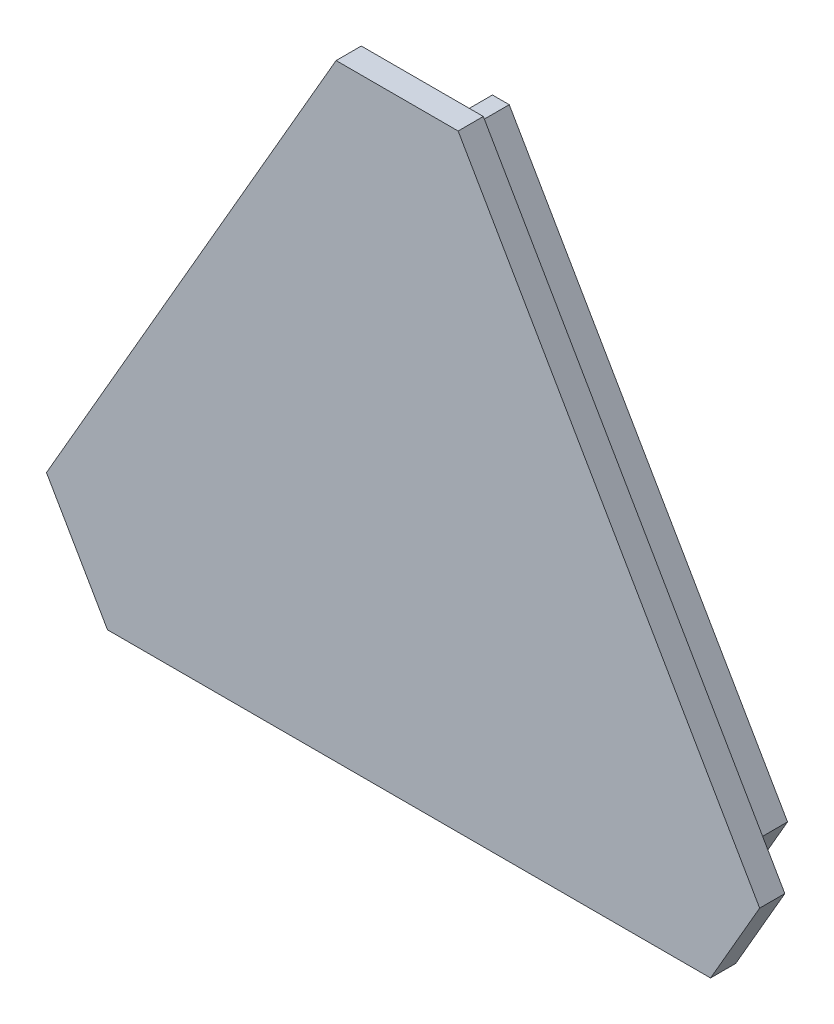
ISO-10303-21;
HEADER;
FILE_DESCRIPTION(('STEP AP214'),'2;1');
FILE_NAME('part.step','',(''),(''),'','','');
FILE_SCHEMA(('AUTOMOTIVE_DESIGN { 1 0 10303 214 1 1 1 1 }'));
ENDSEC;
DATA;
#1=APPLICATION_CONTEXT('core data for automotive mechanical design processes');
#2=APPLICATION_PROTOCOL_DEFINITION('international standard','automotive_design',2000,#1);
#3=PRODUCT_CONTEXT('',#1,'mechanical');
#4=PRODUCT('Part','Part','',(#3));
#5=PRODUCT_RELATED_PRODUCT_CATEGORY('part','',(#4));
#6=PRODUCT_DEFINITION_FORMATION('','',#4);
#7=PRODUCT_DEFINITION_CONTEXT('part definition',#1,'design');
#8=PRODUCT_DEFINITION('design','',#6,#7);
#9=PRODUCT_DEFINITION_SHAPE('','',#8);
#10=(LENGTH_UNIT() NAMED_UNIT(*) SI_UNIT(.MILLI.,.METRE.));
#11=(NAMED_UNIT(*) PLANE_ANGLE_UNIT() SI_UNIT($,.RADIAN.));
#12=(NAMED_UNIT(*) SI_UNIT($,.STERADIAN.) SOLID_ANGLE_UNIT());
#13=UNCERTAINTY_MEASURE_WITH_UNIT(LENGTH_MEASURE(1.E-05),#10,'distance_accuracy_value','');
#14=(GEOMETRIC_REPRESENTATION_CONTEXT(3) GLOBAL_UNCERTAINTY_ASSIGNED_CONTEXT((#13)) GLOBAL_UNIT_ASSIGNED_CONTEXT((#10,
#11,#12)) REPRESENTATION_CONTEXT('',''));
#15=CARTESIAN_POINT('',(0.,0.,0.));
#16=DIRECTION('',(0.,0.,1.));
#17=DIRECTION('',(1.,0.,0.));
#18=AXIS2_PLACEMENT_3D('',#15,#16,#17);
#19=CARTESIAN_POINT('',(222.11595741586,-44.1065145182755,287.147776460053));
#20=DIRECTION('',(0.,1.,0.));
#21=DIRECTION('',(0.,0.,1.));
#22=AXIS2_PLACEMENT_3D('',#19,#20,#21);
#23=PLANE('',#22);
#24=DIRECTION('',(-1.,0.,0.));
#25=VECTOR('',#24,1.);
#26=CARTESIAN_POINT('',(222.11595741586,-44.1065145182755,297.147776460053));
#27=LINE('',#26,#25);
#28=CARTESIAN_POINT('',(222.11595741586,-44.1065145182755,297.147776460053));
#29=VERTEX_POINT('',#28);
#30=CARTESIAN_POINT('',(218.778432853491,-44.1065145182755,297.147776460053));
#31=VERTEX_POINT('',#30);
#32=EDGE_CURVE('E163',#29,#31,#27,.T.);
#33=ORIENTED_EDGE('',*,*,#32,.F.);
#34=DIRECTION('',(0.,0.,1.));
#35=VECTOR('',#34,1.);
#36=CARTESIAN_POINT('',(222.11595741586,-44.1065145182755,287.147776460053));
#37=LINE('',#36,#35);
#38=CARTESIAN_POINT('',(222.11595741586,-44.1065145182755,287.147776460053));
#39=VERTEX_POINT('',#38);
#40=EDGE_CURVE('E11',#39,#29,#37,.T.);
#41=ORIENTED_EDGE('',*,*,#40,.F.);
#42=DIRECTION('',(-1.,0.,0.));
#43=VECTOR('',#42,1.);
#44=CARTESIAN_POINT('',(222.11595741586,-44.1065145182755,287.147776460053));
#45=LINE('',#44,#43);
#46=CARTESIAN_POINT('',(218.778432853491,-44.1065145182755,287.147776460053));
#47=VERTEX_POINT('',#46);
#48=EDGE_CURVE('E182',#39,#47,#45,.T.);
#49=ORIENTED_EDGE('',*,*,#48,.T.);
#50=DIRECTION('',(0.,0.,1.));
#51=VECTOR('',#50,1.);
#52=CARTESIAN_POINT('',(218.778432853491,-44.1065145182755,287.147776460053));
#53=LINE('',#52,#51);
#54=EDGE_CURVE('E37',#47,#31,#53,.T.);
#55=ORIENTED_EDGE('',*,*,#54,.T.);
#56=EDGE_LOOP('',(#33,#41,#49,#55));
#57=FACE_BOUND('',#56,.T.);
#58=ADVANCED_FACE('F34',(#57),#23,.T.);
#59=CARTESIAN_POINT('',(222.11595741586,-44.1065145182755,287.147776460053));
#60=DIRECTION('',(0.866025403784439,0.5,0.));
#61=DIRECTION('',(-0.5,0.866025403784439,0.));
#62=AXIS2_PLACEMENT_3D('',#59,#60,#61);
#63=PLANE('',#62);
#64=DIRECTION('',(-0.5,0.866025403784439,0.));
#65=VECTOR('',#64,1.);
#66=CARTESIAN_POINT('',(222.11595741586,-44.1065145182755,297.147776460053));
#67=LINE('',#66,#65);
#68=CARTESIAN_POINT('',(277.385017308185,-139.835334338348,297.147776460053));
#69=VERTEX_POINT('',#68);
#70=EDGE_CURVE('E89',#69,#29,#67,.T.);
#71=ORIENTED_EDGE('',*,*,#70,.F.);
#72=DIRECTION('',(0.,0.,1.));
#73=VECTOR('',#72,1.);
#74=CARTESIAN_POINT('',(277.385017308185,-139.835334338348,287.147776460053));
#75=LINE('',#74,#73);
#76=CARTESIAN_POINT('',(277.385017308185,-139.835334338348,287.147776460053));
#77=VERTEX_POINT('',#76);
#78=EDGE_CURVE('E43',#77,#69,#75,.T.);
#79=ORIENTED_EDGE('',*,*,#78,.F.);
#80=DIRECTION('',(-0.5,0.866025403784439,0.));
#81=VECTOR('',#80,1.);
#82=CARTESIAN_POINT('',(222.11595741586,-44.1065145182755,287.147776460053));
#83=LINE('',#82,#81);
#84=EDGE_CURVE('E51',#77,#39,#83,.T.);
#85=ORIENTED_EDGE('',*,*,#84,.T.);
#86=ORIENTED_EDGE('',*,*,#40,.T.);
#87=EDGE_LOOP('',(#71,#79,#85,#86));
#88=FACE_BOUND('',#87,.T.);
#89=ADVANCED_FACE('F231',(#88),#63,.T.);
#90=CARTESIAN_POINT('',(277.385017308185,-139.835334338348,287.147776460053));
#91=DIRECTION('',(0.866025403784438,-0.500000000000001,0.));
#92=DIRECTION('',(0.500000000000001,0.866025403784438,0.));
#93=AXIS2_PLACEMENT_3D('',#90,#91,#92);
#94=PLANE('',#93);
#95=DIRECTION('',(0.500000000000001,0.866025403784438,0.));
#96=VECTOR('',#95,1.);
#97=CARTESIAN_POINT('',(277.385017308185,-139.835334338348,297.147776460053));
#98=LINE('',#97,#96);
#99=CARTESIAN_POINT('',(270.11595741586,-152.425715395115,297.147776460053));
#100=VERTEX_POINT('',#99);
#101=EDGE_CURVE('E84',#100,#69,#98,.T.);
#102=ORIENTED_EDGE('',*,*,#101,.F.);
#103=DIRECTION('',(0.,0.,1.));
#104=VECTOR('',#103,1.);
#105=CARTESIAN_POINT('',(270.11595741586,-152.425715395115,287.147776460053));
#106=LINE('',#105,#104);
#107=CARTESIAN_POINT('',(270.11595741586,-152.425715395115,287.147776460053));
#108=VERTEX_POINT('',#107);
#109=EDGE_CURVE('E126',#108,#100,#106,.T.);
#110=ORIENTED_EDGE('',*,*,#109,.F.);
#111=DIRECTION('',(0.500000000000001,0.866025403784438,0.));
#112=VECTOR('',#111,1.);
#113=CARTESIAN_POINT('',(277.385017308185,-139.835334338348,287.147776460053));
#114=LINE('',#113,#112);
#115=EDGE_CURVE('E130',#108,#77,#114,.T.);
#116=ORIENTED_EDGE('',*,*,#115,.T.);
#117=ORIENTED_EDGE('',*,*,#78,.T.);
#118=EDGE_LOOP('',(#102,#110,#116,#117));
#119=FACE_BOUND('',#118,.T.);
#120=ADVANCED_FACE('F136',(#119),#94,.T.);
#121=CARTESIAN_POINT('',(270.11595741586,-152.425715395115,287.147776460053));
#122=DIRECTION('',(0.,-1.,0.));
#123=DIRECTION('',(1.,0.,0.));
#124=AXIS2_PLACEMENT_3D('',#121,#122,#123);
#125=PLANE('',#124);
#126=DIRECTION('',(1.,0.,0.));
#127=VECTOR('',#126,1.);
#128=CARTESIAN_POINT('',(270.11595741586,-152.425715395115,297.147776460053));
#129=LINE('',#128,#127);
#130=CARTESIAN_POINT('',(159.577837631212,-152.425715395115,297.147776460053));
#131=VERTEX_POINT('',#130);
#132=EDGE_CURVE('E179',#131,#100,#129,.T.);
#133=ORIENTED_EDGE('',*,*,#132,.F.);
#134=DIRECTION('',(0.,0.,1.));
#135=VECTOR('',#134,1.);
#136=CARTESIAN_POINT('',(159.577837631212,-152.425715395115,287.147776460053));
#137=LINE('',#136,#135);
#138=CARTESIAN_POINT('',(159.577837631212,-152.425715395115,287.147776460053));
#139=VERTEX_POINT('',#138);
#140=EDGE_CURVE('E128',#139,#131,#137,.T.);
#141=ORIENTED_EDGE('',*,*,#140,.F.);
#142=DIRECTION('',(1.,0.,0.));
#143=VECTOR('',#142,1.);
#144=CARTESIAN_POINT('',(270.11595741586,-152.425715395115,287.147776460053));
#145=LINE('',#144,#143);
#146=EDGE_CURVE('E121',#139,#108,#145,.T.);
#147=ORIENTED_EDGE('',*,*,#146,.T.);
#148=ORIENTED_EDGE('',*,*,#109,.T.);
#149=EDGE_LOOP('',(#133,#141,#147,#148));
#150=FACE_BOUND('',#149,.T.);
#151=ADVANCED_FACE('F124',(#150),#125,.T.);
#152=CARTESIAN_POINT('',(159.577837631212,-152.425715395115,287.147776460053));
#153=DIRECTION('',(-0.866025403784441,-0.499999999999996,0.));
#154=DIRECTION('',(0.499999999999996,-0.866025403784441,0.));
#155=AXIS2_PLACEMENT_3D('',#152,#153,#154);
#156=PLANE('',#155);
#157=DIRECTION('',(0.499999999999996,-0.866025403784441,0.));
#158=VECTOR('',#157,1.);
#159=CARTESIAN_POINT('',(159.577837631212,-152.425715395115,297.147776460053));
#160=LINE('',#159,#158);
#161=CARTESIAN_POINT('',(157.909075350027,-149.535334338348,297.147776460053));
#162=VERTEX_POINT('',#161);
#163=EDGE_CURVE('E177',#162,#131,#160,.T.);
#164=ORIENTED_EDGE('',*,*,#163,.F.);
#165=DIRECTION('',(0.,0.,1.));
#166=VECTOR('',#165,1.);
#167=CARTESIAN_POINT('',(157.909075350027,-149.535334338348,287.147776460053));
#168=LINE('',#167,#166);
#169=CARTESIAN_POINT('',(157.909075350027,-149.535334338348,287.147776460053));
#170=VERTEX_POINT('',#169);
#171=EDGE_CURVE('E139',#170,#162,#168,.T.);
#172=ORIENTED_EDGE('',*,*,#171,.F.);
#173=DIRECTION('',(0.499999999999996,-0.866025403784441,0.));
#174=VECTOR('',#173,1.);
#175=CARTESIAN_POINT('',(159.577837631212,-152.425715395115,287.147776460053));
#176=LINE('',#175,#174);
#177=EDGE_CURVE('E131',#170,#139,#176,.T.);
#178=ORIENTED_EDGE('',*,*,#177,.T.);
#179=ORIENTED_EDGE('',*,*,#140,.T.);
#180=EDGE_LOOP('',(#164,#172,#178,#179));
#181=FACE_BOUND('',#180,.T.);
#182=ADVANCED_FACE('F200',(#181),#156,.T.);
#183=CARTESIAN_POINT('',(157.909075350027,-149.535334338348,287.147776460053));
#184=DIRECTION('',(-0.866025403784442,0.499999999999994,0.));
#185=DIRECTION('',(-0.499999999999994,-0.866025403784442,0.));
#186=AXIS2_PLACEMENT_3D('',#183,#184,#185);
#187=PLANE('',#186);
#188=DIRECTION('',(-0.499999999999994,-0.866025403784442,0.));
#189=VECTOR('',#188,1.);
#190=CARTESIAN_POINT('',(157.909075350027,-149.535334338348,297.147776460053));
#191=LINE('',#190,#189);
#192=CARTESIAN_POINT('',(159.127064414791,-147.425715395115,297.147776460053));
#193=VERTEX_POINT('',#192);
#194=EDGE_CURVE('E175',#193,#162,#191,.T.);
#195=ORIENTED_EDGE('',*,*,#194,.F.);
#196=DIRECTION('',(0.,0.,1.));
#197=VECTOR('',#196,1.);
#198=CARTESIAN_POINT('',(159.127064414791,-147.425715395115,287.147776460053));
#199=LINE('',#198,#197);
#200=CARTESIAN_POINT('',(159.127064414791,-147.425715395115,287.147776460053));
#201=VERTEX_POINT('',#200);
#202=EDGE_CURVE('E144',#201,#193,#199,.T.);
#203=ORIENTED_EDGE('',*,*,#202,.F.);
#204=DIRECTION('',(-0.499999999999994,-0.866025403784442,0.));
#205=VECTOR('',#204,1.);
#206=CARTESIAN_POINT('',(157.909075350027,-149.535334338348,287.147776460053));
#207=LINE('',#206,#205);
#208=EDGE_CURVE('E195',#201,#170,#207,.T.);
#209=ORIENTED_EDGE('',*,*,#208,.T.);
#210=ORIENTED_EDGE('',*,*,#171,.T.);
#211=EDGE_LOOP('',(#195,#203,#209,#210));
#212=FACE_BOUND('',#211,.T.);
#213=ADVANCED_FACE('F208',(#212),#187,.T.);
#214=CARTESIAN_POINT('',(159.127064414791,-147.425715395115,287.147776460053));
#215=DIRECTION('',(0.,1.,0.));
#216=DIRECTION('',(0.,0.,1.));
#217=AXIS2_PLACEMENT_3D('',#214,#215,#216);
#218=PLANE('',#217);
#219=DIRECTION('',(-1.,0.,0.));
#220=VECTOR('',#219,1.);
#221=CARTESIAN_POINT('',(159.127064414791,-147.425715395115,297.147776460053));
#222=LINE('',#221,#220);
#223=CARTESIAN_POINT('',(267.229206069912,-147.425715395115,297.147776460053));
#224=VERTEX_POINT('',#223);
#225=EDGE_CURVE('E173',#224,#193,#222,.T.);
#226=ORIENTED_EDGE('',*,*,#225,.F.);
#227=DIRECTION('',(0.,0.,1.));
#228=VECTOR('',#227,1.);
#229=CARTESIAN_POINT('',(267.229206069912,-147.425715395115,287.147776460053));
#230=LINE('',#229,#228);
#231=CARTESIAN_POINT('',(267.229206069912,-147.425715395115,287.147776460053));
#232=VERTEX_POINT('',#231);
#233=EDGE_CURVE('E147',#232,#224,#230,.T.);
#234=ORIENTED_EDGE('',*,*,#233,.F.);
#235=DIRECTION('',(-1.,0.,0.));
#236=VECTOR('',#235,1.);
#237=CARTESIAN_POINT('',(159.127064414791,-147.425715395115,287.147776460053));
#238=LINE('',#237,#236);
#239=EDGE_CURVE('E193',#232,#201,#238,.T.);
#240=ORIENTED_EDGE('',*,*,#239,.T.);
#241=ORIENTED_EDGE('',*,*,#202,.T.);
#242=EDGE_LOOP('',(#226,#234,#240,#241));
#243=FACE_BOUND('',#242,.T.);
#244=ADVANCED_FACE('F211',(#243),#218,.T.);
#245=CARTESIAN_POINT('',(267.229206069912,-147.425715395115,287.147776460053));
#246=DIRECTION('',(-0.866025403784438,0.500000000000001,0.));
#247=DIRECTION('',(-0.500000000000001,-0.866025403784438,0.));
#248=AXIS2_PLACEMENT_3D('',#245,#246,#247);
#249=PLANE('',#248);
#250=DIRECTION('',(-0.500000000000001,-0.866025403784438,0.));
#251=VECTOR('',#250,1.);
#252=CARTESIAN_POINT('',(267.229206069912,-147.425715395115,297.147776460053));
#253=LINE('',#252,#251);
#254=CARTESIAN_POINT('',(271.611514616288,-139.835334338348,297.147776460053));
#255=VERTEX_POINT('',#254);
#256=EDGE_CURVE('E171',#255,#224,#253,.T.);
#257=ORIENTED_EDGE('',*,*,#256,.F.);
#258=DIRECTION('',(0.,0.,1.));
#259=VECTOR('',#258,1.);
#260=CARTESIAN_POINT('',(271.611514616288,-139.835334338348,287.147776460053));
#261=LINE('',#260,#259);
#262=CARTESIAN_POINT('',(271.611514616288,-139.835334338348,287.147776460053));
#263=VERTEX_POINT('',#262);
#264=EDGE_CURVE('E150',#263,#255,#261,.T.);
#265=ORIENTED_EDGE('',*,*,#264,.F.);
#266=DIRECTION('',(-0.500000000000001,-0.866025403784438,0.));
#267=VECTOR('',#266,1.);
#268=CARTESIAN_POINT('',(267.229206069912,-147.425715395115,287.147776460053));
#269=LINE('',#268,#267);
#270=EDGE_CURVE('E191',#263,#232,#269,.T.);
#271=ORIENTED_EDGE('',*,*,#270,.T.);
#272=ORIENTED_EDGE('',*,*,#233,.T.);
#273=EDGE_LOOP('',(#257,#265,#271,#272));
#274=FACE_BOUND('',#273,.T.);
#275=ADVANCED_FACE('F214',(#274),#249,.T.);
#276=CARTESIAN_POINT('',(271.611514616288,-139.835334338348,287.147776460053));
#277=DIRECTION('',(-0.866025403784438,-0.5,0.));
#278=DIRECTION('',(0.5,-0.866025403784439,0.));
#279=AXIS2_PLACEMENT_3D('',#276,#277,#278);
#280=PLANE('',#279);
#281=DIRECTION('',(0.5,-0.866025403784438,0.));
#282=VECTOR('',#281,1.);
#283=CARTESIAN_POINT('',(271.611514616288,-139.835334338348,297.147776460053));
#284=LINE('',#283,#282);
#285=CARTESIAN_POINT('',(217.560443788727,-46.2161334615091,297.147776460053));
#286=VERTEX_POINT('',#285);
#287=EDGE_CURVE('E169',#286,#255,#284,.T.);
#288=ORIENTED_EDGE('',*,*,#287,.F.);
#289=DIRECTION('',(0.,0.,1.));
#290=VECTOR('',#289,1.);
#291=CARTESIAN_POINT('',(217.560443788727,-46.2161334615091,287.147776460053));
#292=LINE('',#291,#290);
#293=CARTESIAN_POINT('',(217.560443788727,-46.2161334615091,287.147776460053));
#294=VERTEX_POINT('',#293);
#295=EDGE_CURVE('E152',#294,#286,#292,.T.);
#296=ORIENTED_EDGE('',*,*,#295,.F.);
#297=DIRECTION('',(0.5,-0.866025403784438,0.));
#298=VECTOR('',#297,1.);
#299=CARTESIAN_POINT('',(271.611514616288,-139.835334338348,287.147776460053));
#300=LINE('',#299,#298);
#301=EDGE_CURVE('E185',#294,#263,#300,.T.);
#302=ORIENTED_EDGE('',*,*,#301,.T.);
#303=ORIENTED_EDGE('',*,*,#264,.T.);
#304=EDGE_LOOP('',(#288,#296,#302,#303));
#305=FACE_BOUND('',#304,.T.);
#306=ADVANCED_FACE('F217',(#305),#280,.T.);
#307=CARTESIAN_POINT('',(218.778432853491,-44.1065145182755,287.147776460053));
#308=DIRECTION('',(-0.866025403784437,0.500000000000003,0.));
#309=DIRECTION('',(-0.500000000000003,-0.866025403784437,0.));
#310=AXIS2_PLACEMENT_3D('',#307,#308,#309);
#311=PLANE('',#310);
#312=DIRECTION('',(-0.500000000000003,-0.866025403784437,0.));
#313=VECTOR('',#312,1.);
#314=CARTESIAN_POINT('',(218.778432853491,-44.1065145182755,297.147776460053));
#315=LINE('',#314,#313);
#316=EDGE_CURVE('E165',#31,#286,#315,.T.);
#317=ORIENTED_EDGE('',*,*,#316,.F.);
#318=ORIENTED_EDGE('',*,*,#54,.F.);
#319=DIRECTION('',(-0.500000000000003,-0.866025403784437,0.));
#320=VECTOR('',#319,1.);
#321=CARTESIAN_POINT('',(218.778432853491,-44.1065145182755,287.147776460053));
#322=LINE('',#321,#320);
#323=EDGE_CURVE('E96',#47,#294,#322,.T.);
#324=ORIENTED_EDGE('',*,*,#323,.T.);
#325=ORIENTED_EDGE('',*,*,#295,.T.);
#326=EDGE_LOOP('',(#317,#318,#324,#325));
#327=FACE_BOUND('',#326,.T.);
#328=ADVANCED_FACE('F221',(#327),#311,.T.);
#329=CARTESIAN_POINT('',(218.778432853491,-44.1065145182755,287.147776460053));
#330=DIRECTION('',(0.,0.,1.));
#331=DIRECTION('',(1.,0.,0.));
#332=AXIS2_PLACEMENT_3D('',#329,#330,#331);
#333=PLANE('',#332);
#334=ORIENTED_EDGE('',*,*,#48,.F.);
#335=ORIENTED_EDGE('',*,*,#84,.F.);
#336=ORIENTED_EDGE('',*,*,#115,.F.);
#337=ORIENTED_EDGE('',*,*,#146,.F.);
#338=ORIENTED_EDGE('',*,*,#177,.F.);
#339=ORIENTED_EDGE('',*,*,#208,.F.);
#340=ORIENTED_EDGE('',*,*,#239,.F.);
#341=ORIENTED_EDGE('',*,*,#270,.F.);
#342=ORIENTED_EDGE('',*,*,#301,.F.);
#343=ORIENTED_EDGE('',*,*,#323,.F.);
#344=EDGE_LOOP('',(#334,#335,#336,#337,#338,#339,#340,#341,#342,#343));
#345=FACE_BOUND('',#344,.T.);
#346=ADVANCED_FACE('F133',(#345),#333,.F.);
#347=CARTESIAN_POINT('',(145.207369427855,-138.335334338348,302.147776460053));
#348=DIRECTION('',(0.866025403784439,-0.499999999999999,0.));
#349=DIRECTION('',(0.499999999999999,0.866025403784439,0.));
#350=AXIS2_PLACEMENT_3D('',#347,#348,#349);
#351=PLANE('',#350);
#352=DIRECTION('',(-0.499999999999999,-0.866025403784439,0.));
#353=VECTOR('',#352,1.);
#354=CARTESIAN_POINT('',(145.207369427855,-138.335334338348,297.147776460053));
#355=LINE('',#354,#353);
#356=CARTESIAN_POINT('',(202.728095370019,-38.7065145182755,297.147776460053));
#357=VERTEX_POINT('',#356);
#358=CARTESIAN_POINT('',(145.207369427855,-138.335334338348,297.147776460053));
#359=VERTEX_POINT('',#358);
#360=EDGE_CURVE('E450',#357,#359,#355,.T.);
#361=ORIENTED_EDGE('',*,*,#360,.T.);
#362=DIRECTION('',(0.,0.,-1.));
#363=VECTOR('',#362,1.);
#364=CARTESIAN_POINT('',(145.207369427855,-138.335334338348,302.147776460053));
#365=LINE('',#364,#363);
#366=CARTESIAN_POINT('',(145.207369427855,-138.335334338348,302.147776460053));
#367=VERTEX_POINT('',#366);
#368=EDGE_CURVE('E166',#367,#359,#365,.T.);
#369=ORIENTED_EDGE('',*,*,#368,.F.);
#370=DIRECTION('',(-0.499999999999999,-0.866025403784439,0.));
#371=VECTOR('',#370,1.);
#372=CARTESIAN_POINT('',(145.207369427855,-138.335334338348,302.147776460053));
#373=LINE('',#372,#371);
#374=CARTESIAN_POINT('',(202.728095370019,-38.7065145182755,302.147776460053));
#375=VERTEX_POINT('',#374);
#376=EDGE_CURVE('E430',#375,#367,#373,.T.);
#377=ORIENTED_EDGE('',*,*,#376,.F.);
#378=DIRECTION('',(0.,0.,-1.));
#379=VECTOR('',#378,1.);
#380=CARTESIAN_POINT('',(202.728095370019,-38.7065145182755,302.147776460053));
#381=LINE('',#380,#379);
#382=EDGE_CURVE('E467',#375,#357,#381,.T.);
#383=ORIENTED_EDGE('',*,*,#382,.T.);
#384=EDGE_LOOP('',(#361,#369,#377,#383));
#385=FACE_BOUND('',#384,.T.);
#386=ADVANCED_FACE('F227',(#385),#351,.F.);
#387=CARTESIAN_POINT('',(157.326171581372,-159.325715395115,302.147776460053));
#388=DIRECTION('',(0.866025403784439,0.5,0.));
#389=DIRECTION('',(-0.5,0.866025403784439,0.));
#390=AXIS2_PLACEMENT_3D('',#387,#388,#389);
#391=PLANE('',#390);
#392=DIRECTION('',(0.5,-0.866025403784439,0.));
#393=VECTOR('',#392,1.);
#394=CARTESIAN_POINT('',(157.326171581372,-159.325715395115,297.147776460053));
#395=LINE('',#394,#393);
#396=CARTESIAN_POINT('',(157.326171581372,-159.325715395115,297.147776460053));
#397=VERTEX_POINT('',#396);
#398=EDGE_CURVE('E479',#359,#397,#395,.T.);
#399=ORIENTED_EDGE('',*,*,#398,.T.);
#400=DIRECTION('',(0.,0.,-1.));
#401=VECTOR('',#400,1.);
#402=CARTESIAN_POINT('',(157.326171581372,-159.325715395115,302.147776460053));
#403=LINE('',#402,#401);
#404=CARTESIAN_POINT('',(157.326171581372,-159.325715395115,302.147776460053));
#405=VERTEX_POINT('',#404);
#406=EDGE_CURVE('E452',#405,#397,#403,.T.);
#407=ORIENTED_EDGE('',*,*,#406,.F.);
#408=DIRECTION('',(0.5,-0.866025403784439,0.));
#409=VECTOR('',#408,1.);
#410=CARTESIAN_POINT('',(157.326171581372,-159.325715395115,302.147776460053));
#411=LINE('',#410,#409);
#412=EDGE_CURVE('E435',#367,#405,#411,.T.);
#413=ORIENTED_EDGE('',*,*,#412,.F.);
#414=ORIENTED_EDGE('',*,*,#368,.T.);
#415=EDGE_LOOP('',(#399,#407,#413,#414));
#416=FACE_BOUND('',#415,.T.);
#417=ADVANCED_FACE('F334',(#416),#391,.F.);
#418=CARTESIAN_POINT('',(277.096897523536,-159.325715395115,302.147776460053));
#419=DIRECTION('',(0.,1.,0.));
#420=DIRECTION('',(0.,0.,1.));
#421=AXIS2_PLACEMENT_3D('',#418,#419,#420);
#422=PLANE('',#421);
#423=DIRECTION('',(1.,0.,0.));
#424=VECTOR('',#423,1.);
#425=CARTESIAN_POINT('',(277.096897523536,-159.325715395115,297.147776460053));
#426=LINE('',#425,#424);
#427=CARTESIAN_POINT('',(277.096897523536,-159.325715395115,297.147776460053));
#428=VERTEX_POINT('',#427);
#429=EDGE_CURVE('E477',#397,#428,#426,.T.);
#430=ORIENTED_EDGE('',*,*,#429,.T.);
#431=DIRECTION('',(0.,0.,-1.));
#432=VECTOR('',#431,1.);
#433=CARTESIAN_POINT('',(277.096897523536,-159.325715395115,302.147776460053));
#434=LINE('',#433,#432);
#435=CARTESIAN_POINT('',(277.096897523536,-159.325715395115,302.147776460053));
#436=VERTEX_POINT('',#435);
#437=EDGE_CURVE('E454',#436,#428,#434,.T.);
#438=ORIENTED_EDGE('',*,*,#437,.F.);
#439=DIRECTION('',(1.,0.,0.));
#440=VECTOR('',#439,1.);
#441=CARTESIAN_POINT('',(277.096897523536,-159.325715395115,302.147776460053));
#442=LINE('',#441,#440);
#443=EDGE_CURVE('E488',#405,#436,#442,.T.);
#444=ORIENTED_EDGE('',*,*,#443,.F.);
#445=ORIENTED_EDGE('',*,*,#406,.T.);
#446=EDGE_LOOP('',(#430,#438,#444,#445));
#447=FACE_BOUND('',#446,.T.);
#448=ADVANCED_FACE('F343',(#447),#422,.F.);
#449=CARTESIAN_POINT('',(286.851062648135,-142.431005813893,302.147776460053));
#450=DIRECTION('',(-0.866025403784439,0.5,0.));
#451=DIRECTION('',(-0.5,-0.866025403784439,0.));
#452=AXIS2_PLACEMENT_3D('',#449,#450,#451);
#453=PLANE('',#452);
#454=DIRECTION('',(0.5,0.866025403784439,0.));
#455=VECTOR('',#454,1.);
#456=CARTESIAN_POINT('',(286.851062648135,-142.431005813893,297.147776460053));
#457=LINE('',#456,#455);
#458=CARTESIAN_POINT('',(286.851062648135,-142.431005813893,297.147776460053));
#459=VERTEX_POINT('',#458);
#460=EDGE_CURVE('E474',#428,#459,#457,.T.);
#461=ORIENTED_EDGE('',*,*,#460,.T.);
#462=DIRECTION('',(0.,0.,-1.));
#463=VECTOR('',#462,1.);
#464=CARTESIAN_POINT('',(286.851062648135,-142.431005813893,302.147776460053));
#465=LINE('',#464,#463);
#466=CARTESIAN_POINT('',(286.851062648135,-142.431005813893,302.147776460053));
#467=VERTEX_POINT('',#466);
#468=EDGE_CURVE('E459',#467,#459,#465,.T.);
#469=ORIENTED_EDGE('',*,*,#468,.F.);
#470=DIRECTION('',(0.5,0.866025403784439,0.));
#471=VECTOR('',#470,1.);
#472=CARTESIAN_POINT('',(286.851062648135,-142.431005813893,302.147776460053));
#473=LINE('',#472,#471);
#474=EDGE_CURVE('E485',#436,#467,#473,.T.);
#475=ORIENTED_EDGE('',*,*,#474,.F.);
#476=ORIENTED_EDGE('',*,*,#437,.T.);
#477=EDGE_LOOP('',(#461,#469,#475,#476));
#478=FACE_BOUND('',#477,.T.);
#479=ADVANCED_FACE('F353',(#478),#453,.F.);
#480=CARTESIAN_POINT('',(226.965699677053,-38.7065145182755,302.147776460053));
#481=DIRECTION('',(-0.866025403784438,-0.5,0.));
#482=DIRECTION('',(0.5,-0.866025403784438,0.));
#483=AXIS2_PLACEMENT_3D('',#480,#481,#482);
#484=PLANE('',#483);
#485=DIRECTION('',(-0.5,0.866025403784438,0.));
#486=VECTOR('',#485,1.);
#487=CARTESIAN_POINT('',(226.965699677053,-38.7065145182755,297.147776460053));
#488=LINE('',#487,#486);
#489=CARTESIAN_POINT('',(226.965699677053,-38.7065145182755,297.147776460053));
#490=VERTEX_POINT('',#489);
#491=EDGE_CURVE('E471',#459,#490,#488,.T.);
#492=ORIENTED_EDGE('',*,*,#491,.T.);
#493=DIRECTION('',(0.,0.,-1.));
#494=VECTOR('',#493,1.);
#495=CARTESIAN_POINT('',(226.965699677053,-38.7065145182755,302.147776460053));
#496=LINE('',#495,#494);
#497=CARTESIAN_POINT('',(226.965699677053,-38.7065145182755,302.147776460053));
#498=VERTEX_POINT('',#497);
#499=EDGE_CURVE('E464',#498,#490,#496,.T.);
#500=ORIENTED_EDGE('',*,*,#499,.F.);
#501=DIRECTION('',(-0.5,0.866025403784438,0.));
#502=VECTOR('',#501,1.);
#503=CARTESIAN_POINT('',(226.965699677053,-38.7065145182755,302.147776460053));
#504=LINE('',#503,#502);
#505=EDGE_CURVE('E483',#467,#498,#504,.T.);
#506=ORIENTED_EDGE('',*,*,#505,.F.);
#507=ORIENTED_EDGE('',*,*,#468,.T.);
#508=EDGE_LOOP('',(#492,#500,#506,#507));
#509=FACE_BOUND('',#508,.T.);
#510=ADVANCED_FACE('F363',(#509),#484,.F.);
#511=CARTESIAN_POINT('',(202.728095370019,-38.7065145182755,302.147776460053));
#512=DIRECTION('',(0.,-1.,0.));
#513=DIRECTION('',(0.,0.,-1.));
#514=AXIS2_PLACEMENT_3D('',#511,#512,#513);
#515=PLANE('',#514);
#516=DIRECTION('',(-1.,0.,0.));
#517=VECTOR('',#516,1.);
#518=CARTESIAN_POINT('',(202.728095370019,-38.7065145182755,297.147776460053));
#519=LINE('',#518,#517);
#520=EDGE_CURVE('E444',#490,#357,#519,.T.);
#521=ORIENTED_EDGE('',*,*,#520,.T.);
#522=ORIENTED_EDGE('',*,*,#382,.F.);
#523=DIRECTION('',(-1.,0.,0.));
#524=VECTOR('',#523,1.);
#525=CARTESIAN_POINT('',(202.728095370019,-38.7065145182755,302.147776460053));
#526=LINE('',#525,#524);
#527=EDGE_CURVE('E439',#498,#375,#526,.T.);
#528=ORIENTED_EDGE('',*,*,#527,.F.);
#529=ORIENTED_EDGE('',*,*,#499,.T.);
#530=EDGE_LOOP('',(#521,#522,#528,#529));
#531=FACE_BOUND('',#530,.T.);
#532=ADVANCED_FACE('F373',(#531),#515,.F.);
#533=CARTESIAN_POINT('',(202.728095370019,-38.7065145182755,302.147776460053));
#534=DIRECTION('',(0.,0.,-1.));
#535=DIRECTION('',(-1.,0.,0.));
#536=AXIS2_PLACEMENT_3D('',#533,#534,#535);
#537=PLANE('',#536);
#538=ORIENTED_EDGE('',*,*,#376,.T.);
#539=ORIENTED_EDGE('',*,*,#412,.T.);
#540=ORIENTED_EDGE('',*,*,#443,.T.);
#541=ORIENTED_EDGE('',*,*,#474,.T.);
#542=ORIENTED_EDGE('',*,*,#505,.T.);
#543=ORIENTED_EDGE('',*,*,#527,.T.);
#544=EDGE_LOOP('',(#538,#539,#540,#541,#542,#543));
#545=FACE_BOUND('',#544,.T.);
#546=ADVANCED_FACE('F383',(#545),#537,.F.);
#547=CARTESIAN_POINT('',(202.728095370019,-38.7065145182755,297.147776460053));
#548=DIRECTION('',(0.,0.,-1.));
#549=DIRECTION('',(-1.,0.,0.));
#550=AXIS2_PLACEMENT_3D('',#547,#548,#549);
#551=PLANE('',#550);
#552=ORIENTED_EDGE('',*,*,#70,.T.);
#553=ORIENTED_EDGE('',*,*,#32,.T.);
#554=ORIENTED_EDGE('',*,*,#316,.T.);
#555=ORIENTED_EDGE('',*,*,#287,.T.);
#556=ORIENTED_EDGE('',*,*,#256,.T.);
#557=ORIENTED_EDGE('',*,*,#225,.T.);
#558=ORIENTED_EDGE('',*,*,#194,.T.);
#559=ORIENTED_EDGE('',*,*,#163,.T.);
#560=ORIENTED_EDGE('',*,*,#132,.T.);
#561=ORIENTED_EDGE('',*,*,#101,.T.);
#562=EDGE_LOOP('',(#552,#553,#554,#555,#556,#557,#558,#559,#560,#561));
#563=FACE_BOUND('',#562,.T.);
#564=ORIENTED_EDGE('',*,*,#360,.F.);
#565=ORIENTED_EDGE('',*,*,#520,.F.);
#566=ORIENTED_EDGE('',*,*,#491,.F.);
#567=ORIENTED_EDGE('',*,*,#460,.F.);
#568=ORIENTED_EDGE('',*,*,#429,.F.);
#569=ORIENTED_EDGE('',*,*,#398,.F.);
#570=EDGE_LOOP('',(#564,#565,#566,#567,#568,#569));
#571=FACE_BOUND('',#570,.T.);
#572=ADVANCED_FACE('F219',(#563,#571),#551,.T.);
#573=CLOSED_SHELL('',(#58,#89,#120,#151,#182,#213,#244,#275,#306,#328,#346,#386,#417,#448,#479,
#510,#532,#546,#572));
#574=MANIFOLD_SOLID_BREP('B2',#573);
#575=ADVANCED_BREP_SHAPE_REPRESENTATION('',(#18,#574),#14);
#576=SHAPE_DEFINITION_REPRESENTATION(#9,#575);
ENDSEC;
END-ISO-10303-21;
